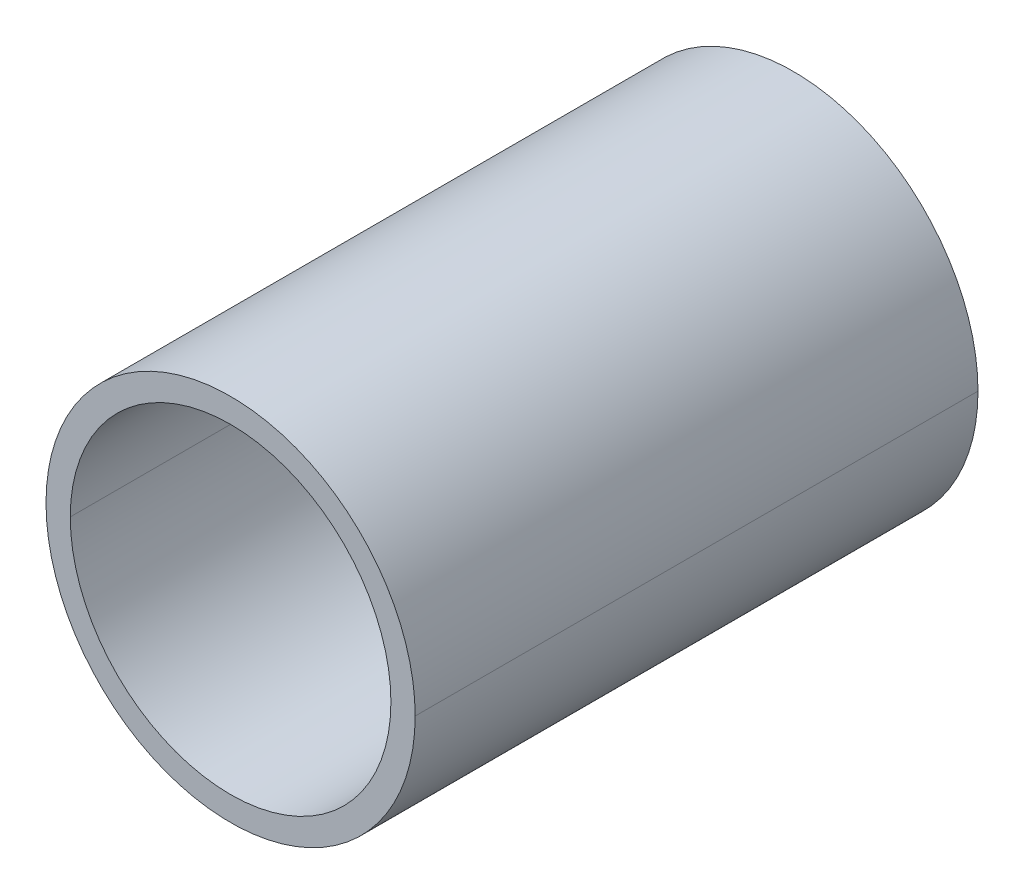
ISO-10303-21;
HEADER;
FILE_DESCRIPTION(('STEP AP214'),'2;1');
FILE_NAME('part.step','',(''),(''),'','','');
FILE_SCHEMA(('AUTOMOTIVE_DESIGN { 1 0 10303 214 1 1 1 1 }'));
ENDSEC;
DATA;
#1=APPLICATION_CONTEXT('core data for automotive mechanical design processes');
#2=APPLICATION_PROTOCOL_DEFINITION('international standard','automotive_design',2000,#1);
#3=PRODUCT_CONTEXT('',#1,'mechanical');
#4=PRODUCT('Part','Part','',(#3));
#5=PRODUCT_RELATED_PRODUCT_CATEGORY('part','',(#4));
#6=PRODUCT_DEFINITION_FORMATION('','',#4);
#7=PRODUCT_DEFINITION_CONTEXT('part definition',#1,'design');
#8=PRODUCT_DEFINITION('design','',#6,#7);
#9=PRODUCT_DEFINITION_SHAPE('','',#8);
#10=(LENGTH_UNIT() NAMED_UNIT(*) SI_UNIT(.MILLI.,.METRE.));
#11=(NAMED_UNIT(*) PLANE_ANGLE_UNIT() SI_UNIT($,.RADIAN.));
#12=(NAMED_UNIT(*) SI_UNIT($,.STERADIAN.) SOLID_ANGLE_UNIT());
#13=UNCERTAINTY_MEASURE_WITH_UNIT(LENGTH_MEASURE(1.E-05),#10,'distance_accuracy_value','');
#14=(GEOMETRIC_REPRESENTATION_CONTEXT(3) GLOBAL_UNCERTAINTY_ASSIGNED_CONTEXT((#13)) GLOBAL_UNIT_ASSIGNED_CONTEXT((#10,
#11,#12)) REPRESENTATION_CONTEXT('',''));
#15=CARTESIAN_POINT('',(0.,0.,0.));
#16=DIRECTION('',(0.,0.,1.));
#17=DIRECTION('',(1.,0.,0.));
#18=AXIS2_PLACEMENT_3D('',#15,#16,#17);
#19=CARTESIAN_POINT('',(0.,0.,8.4709));
#20=DIRECTION('',(0.,0.,-1.));
#21=DIRECTION('',(-1.,0.,0.));
#22=AXIS2_PLACEMENT_3D('',#19,#20,#21);
#23=CYLINDRICAL_SURFACE('',#22,4.826);
#24=DIRECTION('',(0.,0.,-1.));
#25=VECTOR('',#24,1.);
#26=CARTESIAN_POINT('',(4.826,0.,8.4709));
#27=LINE('',#26,#25);
#28=CARTESIAN_POINT('',(4.826,0.,8.4709));
#29=VERTEX_POINT('',#28);
#30=CARTESIAN_POINT('',(4.826,0.,-8.4709));
#31=VERTEX_POINT('',#30);
#32=EDGE_CURVE('E98',#29,#31,#27,.T.);
#33=ORIENTED_EDGE('',*,*,#32,.F.);
#34=CARTESIAN_POINT('',(0.,0.,8.4709));
#35=DIRECTION('',(0.,0.,1.));
#36=DIRECTION('',(1.,0.,0.));
#37=AXIS2_PLACEMENT_3D('',#34,#35,#36);
#38=CIRCLE('',#37,4.826);
#39=CARTESIAN_POINT('',(-4.826,0.,8.4709));
#40=VERTEX_POINT('',#39);
#41=EDGE_CURVE('E75',#29,#40,#38,.T.);
#42=ORIENTED_EDGE('',*,*,#41,.T.);
#43=DIRECTION('',(0.,0.,-1.));
#44=VECTOR('',#43,1.);
#45=CARTESIAN_POINT('',(-4.826,0.,8.4709));
#46=LINE('',#45,#44);
#47=CARTESIAN_POINT('',(-4.826,0.,-8.4709));
#48=VERTEX_POINT('',#47);
#49=EDGE_CURVE('E87',#40,#48,#46,.T.);
#50=ORIENTED_EDGE('',*,*,#49,.T.);
#51=CARTESIAN_POINT('',(0.,0.,-8.4709));
#52=DIRECTION('',(0.,0.,1.));
#53=DIRECTION('',(1.,0.,0.));
#54=AXIS2_PLACEMENT_3D('',#51,#52,#53);
#55=CIRCLE('',#54,4.826);
#56=EDGE_CURVE('E11',#31,#48,#55,.T.);
#57=ORIENTED_EDGE('',*,*,#56,.F.);
#58=EDGE_LOOP('',(#33,#42,#50,#57));
#59=FACE_BOUND('',#58,.T.);
#60=ADVANCED_FACE('F17',(#59),#23,.F.);
#61=CARTESIAN_POINT('',(0.,0.,8.4709));
#62=DIRECTION('',(0.,0.,-1.));
#63=DIRECTION('',(-1.,0.,0.));
#64=AXIS2_PLACEMENT_3D('',#61,#62,#63);
#65=CYLINDRICAL_SURFACE('',#64,5.55625);
#66=DIRECTION('',(0.,0.,-1.));
#67=VECTOR('',#66,1.);
#68=CARTESIAN_POINT('',(5.55625,0.,8.4709));
#69=LINE('',#68,#67);
#70=CARTESIAN_POINT('',(5.55625,0.,8.4709));
#71=VERTEX_POINT('',#70);
#72=CARTESIAN_POINT('',(5.55625,0.,-8.4709));
#73=VERTEX_POINT('',#72);
#74=EDGE_CURVE('E78',#71,#73,#69,.T.);
#75=ORIENTED_EDGE('',*,*,#74,.F.);
#76=CARTESIAN_POINT('',(0.,0.,8.4709));
#77=DIRECTION('',(0.,0.,1.));
#78=DIRECTION('',(1.,0.,0.));
#79=AXIS2_PLACEMENT_3D('',#76,#77,#78);
#80=CIRCLE('',#79,5.55625);
#81=CARTESIAN_POINT('',(-5.55625,0.,8.4709));
#82=VERTEX_POINT('',#81);
#83=EDGE_CURVE('E21',#82,#71,#80,.T.);
#84=ORIENTED_EDGE('',*,*,#83,.F.);
#85=DIRECTION('',(0.,0.,-1.));
#86=VECTOR('',#85,1.);
#87=CARTESIAN_POINT('',(-5.55625,0.,8.4709));
#88=LINE('',#87,#86);
#89=CARTESIAN_POINT('',(-5.55625,0.,-8.4709));
#90=VERTEX_POINT('',#89);
#91=EDGE_CURVE('E76',#82,#90,#88,.T.);
#92=ORIENTED_EDGE('',*,*,#91,.T.);
#93=CARTESIAN_POINT('',(0.,0.,-8.4709));
#94=DIRECTION('',(0.,0.,1.));
#95=DIRECTION('',(1.,0.,0.));
#96=AXIS2_PLACEMENT_3D('',#93,#94,#95);
#97=CIRCLE('',#96,5.55625);
#98=EDGE_CURVE('E28',#90,#73,#97,.T.);
#99=ORIENTED_EDGE('',*,*,#98,.T.);
#100=EDGE_LOOP('',(#75,#84,#92,#99));
#101=FACE_BOUND('',#100,.T.);
#102=ADVANCED_FACE('F79',(#101),#65,.T.);
#103=CARTESIAN_POINT('',(0.,0.,-8.4709));
#104=DIRECTION('',(0.,0.,1.));
#105=DIRECTION('',(1.,0.,0.));
#106=AXIS2_PLACEMENT_3D('',#103,#104,#105);
#107=PLANE('',#106);
#108=CARTESIAN_POINT('',(0.,0.,-8.4709));
#109=DIRECTION('',(0.,0.,1.));
#110=DIRECTION('',(1.,0.,0.));
#111=AXIS2_PLACEMENT_3D('',#108,#109,#110);
#112=CIRCLE('',#111,4.826);
#113=EDGE_CURVE('E94',#48,#31,#112,.T.);
#114=ORIENTED_EDGE('',*,*,#113,.T.);
#115=ORIENTED_EDGE('',*,*,#56,.T.);
#116=EDGE_LOOP('',(#114,#115));
#117=FACE_BOUND('',#116,.T.);
#118=ORIENTED_EDGE('',*,*,#98,.F.);
#119=CARTESIAN_POINT('',(0.,0.,-8.4709));
#120=DIRECTION('',(0.,0.,1.));
#121=DIRECTION('',(1.,0.,0.));
#122=AXIS2_PLACEMENT_3D('',#119,#120,#121);
#123=CIRCLE('',#122,5.55625);
#124=EDGE_CURVE('E83',#73,#90,#123,.T.);
#125=ORIENTED_EDGE('',*,*,#124,.F.);
#126=EDGE_LOOP('',(#118,#125));
#127=FACE_BOUND('',#126,.T.);
#128=ADVANCED_FACE('F19',(#117,#127),#107,.F.);
#129=CARTESIAN_POINT('',(0.,0.,8.4709));
#130=DIRECTION('',(0.,0.,1.));
#131=DIRECTION('',(1.,0.,0.));
#132=AXIS2_PLACEMENT_3D('',#129,#130,#131);
#133=PLANE('',#132);
#134=CARTESIAN_POINT('',(0.,0.,8.4709));
#135=DIRECTION('',(0.,0.,1.));
#136=DIRECTION('',(1.,0.,0.));
#137=AXIS2_PLACEMENT_3D('',#134,#135,#136);
#138=CIRCLE('',#137,4.826);
#139=EDGE_CURVE('E101',#40,#29,#138,.T.);
#140=ORIENTED_EDGE('',*,*,#139,.F.);
#141=ORIENTED_EDGE('',*,*,#41,.F.);
#142=EDGE_LOOP('',(#140,#141));
#143=FACE_BOUND('',#142,.T.);
#144=ORIENTED_EDGE('',*,*,#83,.T.);
#145=CARTESIAN_POINT('',(0.,0.,8.4709));
#146=DIRECTION('',(0.,0.,1.));
#147=DIRECTION('',(1.,0.,0.));
#148=AXIS2_PLACEMENT_3D('',#145,#146,#147);
#149=CIRCLE('',#148,5.55625);
#150=EDGE_CURVE('E71',#71,#82,#149,.T.);
#151=ORIENTED_EDGE('',*,*,#150,.T.);
#152=EDGE_LOOP('',(#144,#151));
#153=FACE_BOUND('',#152,.T.);
#154=ADVANCED_FACE('F69',(#143,#153),#133,.T.);
#155=CARTESIAN_POINT('',(0.,0.,8.4709));
#156=DIRECTION('',(0.,0.,-1.));
#157=DIRECTION('',(-1.,0.,0.));
#158=AXIS2_PLACEMENT_3D('',#155,#156,#157);
#159=CYLINDRICAL_SURFACE('',#158,5.55625);
#160=ORIENTED_EDGE('',*,*,#150,.F.);
#161=ORIENTED_EDGE('',*,*,#74,.T.);
#162=ORIENTED_EDGE('',*,*,#124,.T.);
#163=ORIENTED_EDGE('',*,*,#91,.F.);
#164=EDGE_LOOP('',(#160,#161,#162,#163));
#165=FACE_BOUND('',#164,.T.);
#166=ADVANCED_FACE('F85',(#165),#159,.T.);
#167=CARTESIAN_POINT('',(0.,0.,8.4709));
#168=DIRECTION('',(0.,0.,-1.));
#169=DIRECTION('',(-1.,0.,0.));
#170=AXIS2_PLACEMENT_3D('',#167,#168,#169);
#171=CYLINDRICAL_SURFACE('',#170,4.826);
#172=ORIENTED_EDGE('',*,*,#139,.T.);
#173=ORIENTED_EDGE('',*,*,#32,.T.);
#174=ORIENTED_EDGE('',*,*,#113,.F.);
#175=ORIENTED_EDGE('',*,*,#49,.F.);
#176=EDGE_LOOP('',(#172,#173,#174,#175));
#177=FACE_BOUND('',#176,.T.);
#178=ADVANCED_FACE('F135',(#177),#171,.F.);
#179=CLOSED_SHELL('',(#60,#102,#128,#154,#166,#178));
#180=MANIFOLD_SOLID_BREP('B1',#179);
#181=ADVANCED_BREP_SHAPE_REPRESENTATION('',(#18,#180),#14);
#182=SHAPE_DEFINITION_REPRESENTATION(#9,#181);
ENDSEC;
END-ISO-10303-21;
